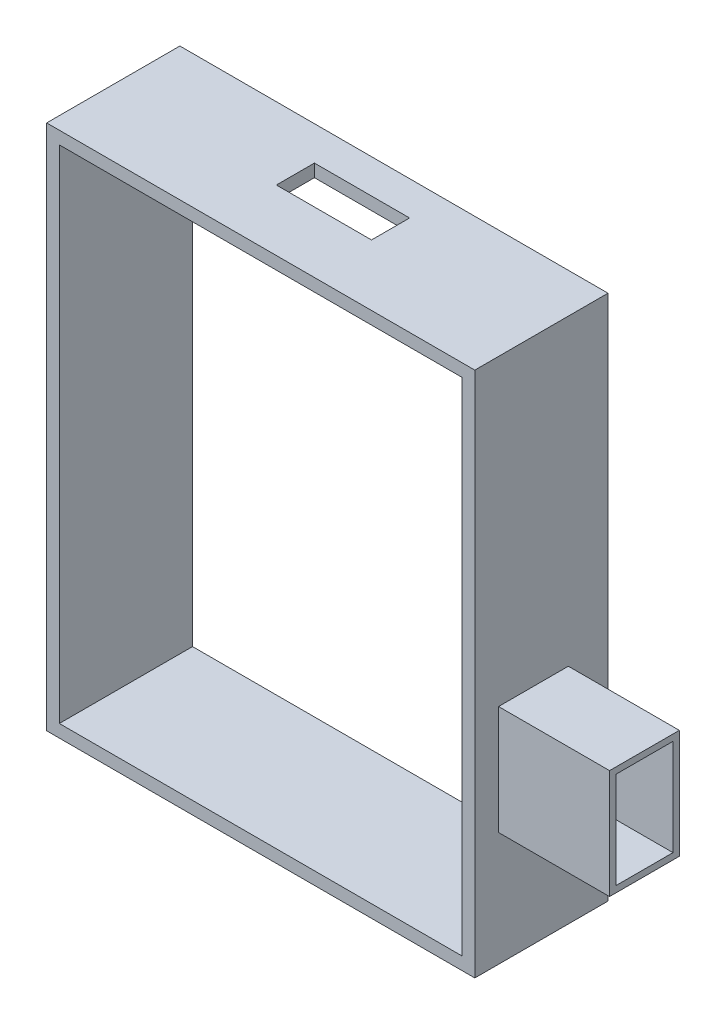
ISO-10303-21;
HEADER;
FILE_DESCRIPTION(('STEP AP214'),'2;1');
FILE_NAME('part.step','',(''),(''),'','','');
FILE_SCHEMA(('AUTOMOTIVE_DESIGN { 1 0 10303 214 1 1 1 1 }'));
ENDSEC;
DATA;
#1=APPLICATION_CONTEXT('core data for automotive mechanical design processes');
#2=APPLICATION_PROTOCOL_DEFINITION('international standard','automotive_design',2000,#1);
#3=PRODUCT_CONTEXT('',#1,'mechanical');
#4=PRODUCT('Part','Part','',(#3));
#5=PRODUCT_RELATED_PRODUCT_CATEGORY('part','',(#4));
#6=PRODUCT_DEFINITION_FORMATION('','',#4);
#7=PRODUCT_DEFINITION_CONTEXT('part definition',#1,'design');
#8=PRODUCT_DEFINITION('design','',#6,#7);
#9=PRODUCT_DEFINITION_SHAPE('','',#8);
#10=(LENGTH_UNIT() NAMED_UNIT(*) SI_UNIT(.MILLI.,.METRE.));
#11=(NAMED_UNIT(*) PLANE_ANGLE_UNIT() SI_UNIT($,.RADIAN.));
#12=(NAMED_UNIT(*) SI_UNIT($,.STERADIAN.) SOLID_ANGLE_UNIT());
#13=UNCERTAINTY_MEASURE_WITH_UNIT(LENGTH_MEASURE(1.E-05),#10,'distance_accuracy_value','');
#14=(GEOMETRIC_REPRESENTATION_CONTEXT(3) GLOBAL_UNCERTAINTY_ASSIGNED_CONTEXT((#13)) GLOBAL_UNIT_ASSIGNED_CONTEXT((#10,
#11,#12)) REPRESENTATION_CONTEXT('',''));
#15=CARTESIAN_POINT('',(0.,0.,0.));
#16=DIRECTION('',(0.,0.,1.));
#17=DIRECTION('',(1.,0.,0.));
#18=AXIS2_PLACEMENT_3D('',#15,#16,#17);
#19=CARTESIAN_POINT('',(33.75,41.5,21.));
#20=DIRECTION('',(-1.,0.,0.));
#21=DIRECTION('',(0.,-1.,0.));
#22=AXIS2_PLACEMENT_3D('',#19,#20,#21);
#23=PLANE('',#22);
#24=DIRECTION('',(0.,1.,0.));
#25=VECTOR('',#24,1.);
#26=CARTESIAN_POINT('',(33.75,41.5,0.));
#27=LINE('',#26,#25);
#28=CARTESIAN_POINT('',(33.75,-41.5,0.));
#29=VERTEX_POINT('',#28);
#30=CARTESIAN_POINT('',(33.75,41.5,0.));
#31=VERTEX_POINT('',#30);
#32=EDGE_CURVE('E340',#29,#31,#27,.T.);
#33=ORIENTED_EDGE('',*,*,#32,.T.);
#34=DIRECTION('',(0.,0.,-1.));
#35=VECTOR('',#34,1.);
#36=CARTESIAN_POINT('',(33.75,41.5,21.));
#37=LINE('',#36,#35);
#38=CARTESIAN_POINT('',(33.75,41.5,21.));
#39=VERTEX_POINT('',#38);
#40=EDGE_CURVE('E378',#39,#31,#37,.T.);
#41=ORIENTED_EDGE('',*,*,#40,.F.);
#42=DIRECTION('',(0.,1.,0.));
#43=VECTOR('',#42,1.);
#44=CARTESIAN_POINT('',(33.75,41.5,21.));
#45=LINE('',#44,#43);
#46=CARTESIAN_POINT('',(33.75,-41.5,21.));
#47=VERTEX_POINT('',#46);
#48=EDGE_CURVE('E341',#47,#39,#45,.T.);
#49=ORIENTED_EDGE('',*,*,#48,.F.);
#50=DIRECTION('',(0.,0.,-1.));
#51=VECTOR('',#50,1.);
#52=CARTESIAN_POINT('',(33.75,-41.5,21.));
#53=LINE('',#52,#51);
#54=EDGE_CURVE('E355',#47,#29,#53,.T.);
#55=ORIENTED_EDGE('',*,*,#54,.T.);
#56=EDGE_LOOP('',(#33,#41,#49,#55));
#57=FACE_BOUND('',#56,.T.);
#58=DIRECTION('',(0.,1.,0.));
#59=VECTOR('',#58,1.);
#60=CARTESIAN_POINT('',(33.75,-23.5071257530308,6.25455683701878));
#61=LINE('',#60,#59);
#62=CARTESIAN_POINT('',(33.75,-23.5071257530308,6.25455683701878));
#63=VERTEX_POINT('',#62);
#64=CARTESIAN_POINT('',(33.75,-6.30712575303083,6.25455683701878));
#65=VERTEX_POINT('',#64);
#66=EDGE_CURVE('E252',#63,#65,#61,.T.);
#67=ORIENTED_EDGE('',*,*,#66,.F.);
#68=DIRECTION('',(0.,0.,-1.));
#69=VECTOR('',#68,1.);
#70=CARTESIAN_POINT('',(33.75,-23.5071257530308,6.25455683701878));
#71=LINE('',#70,#69);
#72=CARTESIAN_POINT('',(33.75,-23.5071257530308,17.2545568370188));
#73=VERTEX_POINT('',#72);
#74=EDGE_CURVE('E258',#73,#63,#71,.T.);
#75=ORIENTED_EDGE('',*,*,#74,.F.);
#76=DIRECTION('',(0.,-1.,0.));
#77=VECTOR('',#76,1.);
#78=CARTESIAN_POINT('',(33.75,-23.5071257530308,17.2545568370188));
#79=LINE('',#78,#77);
#80=CARTESIAN_POINT('',(33.75,-6.30712575303084,17.2545568370188));
#81=VERTEX_POINT('',#80);
#82=EDGE_CURVE('E275',#81,#73,#79,.T.);
#83=ORIENTED_EDGE('',*,*,#82,.F.);
#84=DIRECTION('',(0.,0.,1.));
#85=VECTOR('',#84,1.);
#86=CARTESIAN_POINT('',(33.75,-6.30712575303083,6.25455683701878));
#87=LINE('',#86,#85);
#88=EDGE_CURVE('E271',#65,#81,#87,.T.);
#89=ORIENTED_EDGE('',*,*,#88,.F.);
#90=EDGE_LOOP('',(#67,#75,#83,#89));
#91=FACE_BOUND('',#90,.T.);
#92=ADVANCED_FACE('F47',(#57,#91),#23,.F.);
#93=CARTESIAN_POINT('',(0.,0.,21.));
#94=DIRECTION('',(0.,0.,-1.));
#95=DIRECTION('',(-1.,0.,0.));
#96=AXIS2_PLACEMENT_3D('',#93,#94,#95);
#97=PLANE('',#96);
#98=ORIENTED_EDGE('',*,*,#48,.T.);
#99=DIRECTION('',(-1.,0.,0.));
#100=VECTOR('',#99,1.);
#101=CARTESIAN_POINT('',(33.75,41.5,21.));
#102=LINE('',#101,#100);
#103=CARTESIAN_POINT('',(-33.75,41.5,21.));
#104=VERTEX_POINT('',#103);
#105=EDGE_CURVE('E345',#39,#104,#102,.T.);
#106=ORIENTED_EDGE('',*,*,#105,.T.);
#107=DIRECTION('',(0.,-1.,0.));
#108=VECTOR('',#107,1.);
#109=CARTESIAN_POINT('',(-33.75,41.5,21.));
#110=LINE('',#109,#108);
#111=CARTESIAN_POINT('',(-33.75,-41.5,21.));
#112=VERTEX_POINT('',#111);
#113=EDGE_CURVE('E349',#104,#112,#110,.T.);
#114=ORIENTED_EDGE('',*,*,#113,.T.);
#115=DIRECTION('',(1.,0.,0.));
#116=VECTOR('',#115,1.);
#117=CARTESIAN_POINT('',(33.75,-41.5,21.));
#118=LINE('',#117,#116);
#119=EDGE_CURVE('E352',#112,#47,#118,.T.);
#120=ORIENTED_EDGE('',*,*,#119,.T.);
#121=EDGE_LOOP('',(#98,#106,#114,#120));
#122=FACE_BOUND('',#121,.T.);
#123=DIRECTION('',(0.,-1.,0.));
#124=VECTOR('',#123,1.);
#125=CARTESIAN_POINT('',(-31.75,39.5,21.));
#126=LINE('',#125,#124);
#127=CARTESIAN_POINT('',(-31.75,39.5,21.));
#128=VERTEX_POINT('',#127);
#129=CARTESIAN_POINT('',(-31.75,-39.5,21.));
#130=VERTEX_POINT('',#129);
#131=EDGE_CURVE('E298',#128,#130,#126,.T.);
#132=ORIENTED_EDGE('',*,*,#131,.F.);
#133=DIRECTION('',(-1.,0.,0.));
#134=VECTOR('',#133,1.);
#135=CARTESIAN_POINT('',(31.75,39.5,21.));
#136=LINE('',#135,#134);
#137=CARTESIAN_POINT('',(31.75,39.5,21.));
#138=VERTEX_POINT('',#137);
#139=EDGE_CURVE('E309',#138,#128,#136,.T.);
#140=ORIENTED_EDGE('',*,*,#139,.F.);
#141=DIRECTION('',(0.,1.,0.));
#142=VECTOR('',#141,1.);
#143=CARTESIAN_POINT('',(31.75,39.5,21.));
#144=LINE('',#143,#142);
#145=CARTESIAN_POINT('',(31.75,-39.5,21.));
#146=VERTEX_POINT('',#145);
#147=EDGE_CURVE('E305',#146,#138,#144,.T.);
#148=ORIENTED_EDGE('',*,*,#147,.F.);
#149=DIRECTION('',(1.,0.,0.));
#150=VECTOR('',#149,1.);
#151=CARTESIAN_POINT('',(31.75,-39.5,21.));
#152=LINE('',#151,#150);
#153=EDGE_CURVE('E301',#130,#146,#152,.T.);
#154=ORIENTED_EDGE('',*,*,#153,.F.);
#155=EDGE_LOOP('',(#132,#140,#148,#154));
#156=FACE_BOUND('',#155,.T.);
#157=ADVANCED_FACE('F436',(#122,#156),#97,.F.);
#158=CARTESIAN_POINT('',(0.,0.,0.));
#159=DIRECTION('',(0.,0.,-1.));
#160=DIRECTION('',(-1.,0.,0.));
#161=AXIS2_PLACEMENT_3D('',#158,#159,#160);
#162=PLANE('',#161);
#163=ORIENTED_EDGE('',*,*,#32,.F.);
#164=DIRECTION('',(1.,0.,0.));
#165=VECTOR('',#164,1.);
#166=CARTESIAN_POINT('',(33.75,-41.5,0.));
#167=LINE('',#166,#165);
#168=CARTESIAN_POINT('',(-33.75,-41.5,0.));
#169=VERTEX_POINT('',#168);
#170=EDGE_CURVE('E346',#169,#29,#167,.T.);
#171=ORIENTED_EDGE('',*,*,#170,.F.);
#172=DIRECTION('',(0.,-1.,0.));
#173=VECTOR('',#172,1.);
#174=CARTESIAN_POINT('',(-33.75,41.5,0.));
#175=LINE('',#174,#173);
#176=CARTESIAN_POINT('',(-33.75,41.5,0.));
#177=VERTEX_POINT('',#176);
#178=EDGE_CURVE('E362',#177,#169,#175,.T.);
#179=ORIENTED_EDGE('',*,*,#178,.F.);
#180=DIRECTION('',(-1.,0.,0.));
#181=VECTOR('',#180,1.);
#182=CARTESIAN_POINT('',(33.75,41.5,0.));
#183=LINE('',#182,#181);
#184=EDGE_CURVE('E359',#31,#177,#183,.T.);
#185=ORIENTED_EDGE('',*,*,#184,.F.);
#186=EDGE_LOOP('',(#163,#171,#179,#185));
#187=FACE_BOUND('',#186,.T.);
#188=DIRECTION('',(-1.,0.,0.));
#189=VECTOR('',#188,1.);
#190=CARTESIAN_POINT('',(31.75,39.5,0.));
#191=LINE('',#190,#189);
#192=CARTESIAN_POINT('',(31.75,39.5,0.));
#193=VERTEX_POINT('',#192);
#194=CARTESIAN_POINT('',(-31.75,39.5,0.));
#195=VERTEX_POINT('',#194);
#196=EDGE_CURVE('E302',#193,#195,#191,.T.);
#197=ORIENTED_EDGE('',*,*,#196,.T.);
#198=DIRECTION('',(0.,-1.,0.));
#199=VECTOR('',#198,1.);
#200=CARTESIAN_POINT('',(-31.75,39.5,0.));
#201=LINE('',#200,#199);
#202=CARTESIAN_POINT('',(-31.75,-39.5,0.));
#203=VERTEX_POINT('',#202);
#204=EDGE_CURVE('E297',#195,#203,#201,.T.);
#205=ORIENTED_EDGE('',*,*,#204,.T.);
#206=DIRECTION('',(1.,0.,0.));
#207=VECTOR('',#206,1.);
#208=CARTESIAN_POINT('',(31.75,-39.5,0.));
#209=LINE('',#208,#207);
#210=CARTESIAN_POINT('',(31.75,-39.5,0.));
#211=VERTEX_POINT('',#210);
#212=EDGE_CURVE('E316',#203,#211,#209,.T.);
#213=ORIENTED_EDGE('',*,*,#212,.T.);
#214=DIRECTION('',(0.,1.,0.));
#215=VECTOR('',#214,1.);
#216=CARTESIAN_POINT('',(31.75,39.5,0.));
#217=LINE('',#216,#215);
#218=EDGE_CURVE('E320',#211,#193,#217,.T.);
#219=ORIENTED_EDGE('',*,*,#218,.T.);
#220=EDGE_LOOP('',(#197,#205,#213,#219));
#221=FACE_BOUND('',#220,.T.);
#222=ADVANCED_FACE('F443',(#187,#221),#162,.T.);
#223=CARTESIAN_POINT('',(33.75,41.5,21.));
#224=DIRECTION('',(0.,-1.,0.));
#225=DIRECTION('',(1.,0.,0.));
#226=AXIS2_PLACEMENT_3D('',#223,#224,#225);
#227=PLANE('',#226);
#228=DIRECTION('',(1.,0.,0.));
#229=VECTOR('',#228,1.);
#230=CARTESIAN_POINT('',(7.83952370392265,41.5,11.3731016970316));
#231=LINE('',#230,#229);
#232=CARTESIAN_POINT('',(-7.16047629607734,41.5,11.3731016970316));
#233=VERTEX_POINT('',#232);
#234=CARTESIAN_POINT('',(7.83952370392265,41.5,11.3731016970316));
#235=VERTEX_POINT('',#234);
#236=EDGE_CURVE('E203',#233,#235,#231,.T.);
#237=ORIENTED_EDGE('',*,*,#236,.F.);
#238=DIRECTION('',(0.,0.,1.));
#239=VECTOR('',#238,1.);
#240=CARTESIAN_POINT('',(-7.16047629607735,41.5,5.37310169703157));
#241=LINE('',#240,#239);
#242=CARTESIAN_POINT('',(-7.16047629607735,41.5,5.37310169703157));
#243=VERTEX_POINT('',#242);
#244=EDGE_CURVE('E63',#243,#233,#241,.T.);
#245=ORIENTED_EDGE('',*,*,#244,.F.);
#246=DIRECTION('',(-1.,0.,0.));
#247=VECTOR('',#246,1.);
#248=CARTESIAN_POINT('',(7.83952370392265,41.5,5.37310169703157));
#249=LINE('',#248,#247);
#250=CARTESIAN_POINT('',(7.83952370392265,41.5,5.37310169703157));
#251=VERTEX_POINT('',#250);
#252=EDGE_CURVE('E211',#251,#243,#249,.T.);
#253=ORIENTED_EDGE('',*,*,#252,.F.);
#254=DIRECTION('',(0.,0.,-1.));
#255=VECTOR('',#254,1.);
#256=CARTESIAN_POINT('',(7.83952370392265,41.5,5.37310169703157));
#257=LINE('',#256,#255);
#258=EDGE_CURVE('E193',#235,#251,#257,.T.);
#259=ORIENTED_EDGE('',*,*,#258,.F.);
#260=EDGE_LOOP('',(#237,#245,#253,#259));
#261=FACE_BOUND('',#260,.T.);
#262=ORIENTED_EDGE('',*,*,#184,.T.);
#263=DIRECTION('',(0.,0.,-1.));
#264=VECTOR('',#263,1.);
#265=CARTESIAN_POINT('',(-33.75,41.5,21.));
#266=LINE('',#265,#264);
#267=EDGE_CURVE('E374',#104,#177,#266,.T.);
#268=ORIENTED_EDGE('',*,*,#267,.F.);
#269=ORIENTED_EDGE('',*,*,#105,.F.);
#270=ORIENTED_EDGE('',*,*,#40,.T.);
#271=EDGE_LOOP('',(#262,#268,#269,#270));
#272=FACE_BOUND('',#271,.T.);
#273=ADVANCED_FACE('F208',(#261,#272),#227,.F.);
#274=CARTESIAN_POINT('',(-33.75,41.5,21.));
#275=DIRECTION('',(1.,0.,0.));
#276=DIRECTION('',(0.,1.,0.));
#277=AXIS2_PLACEMENT_3D('',#274,#275,#276);
#278=PLANE('',#277);
#279=ORIENTED_EDGE('',*,*,#178,.T.);
#280=DIRECTION('',(0.,0.,-1.));
#281=VECTOR('',#280,1.);
#282=CARTESIAN_POINT('',(-33.75,-41.5,21.));
#283=LINE('',#282,#281);
#284=EDGE_CURVE('E370',#112,#169,#283,.T.);
#285=ORIENTED_EDGE('',*,*,#284,.F.);
#286=ORIENTED_EDGE('',*,*,#113,.F.);
#287=ORIENTED_EDGE('',*,*,#267,.T.);
#288=EDGE_LOOP('',(#279,#285,#286,#287));
#289=FACE_BOUND('',#288,.T.);
#290=ADVANCED_FACE('F450',(#289),#278,.F.);
#291=CARTESIAN_POINT('',(33.75,-41.5,21.));
#292=DIRECTION('',(0.,1.,0.));
#293=DIRECTION('',(-1.,0.,0.));
#294=AXIS2_PLACEMENT_3D('',#291,#292,#293);
#295=PLANE('',#294);
#296=ORIENTED_EDGE('',*,*,#170,.T.);
#297=ORIENTED_EDGE('',*,*,#54,.F.);
#298=ORIENTED_EDGE('',*,*,#119,.F.);
#299=ORIENTED_EDGE('',*,*,#284,.T.);
#300=EDGE_LOOP('',(#296,#297,#298,#299));
#301=FACE_BOUND('',#300,.T.);
#302=ADVANCED_FACE('F453',(#301),#295,.F.);
#303=CARTESIAN_POINT('',(-31.75,39.5,21.));
#304=DIRECTION('',(1.,0.,0.));
#305=DIRECTION('',(0.,0.,-1.));
#306=AXIS2_PLACEMENT_3D('',#303,#304,#305);
#307=PLANE('',#306);
#308=ORIENTED_EDGE('',*,*,#204,.F.);
#309=DIRECTION('',(0.,0.,-1.));
#310=VECTOR('',#309,1.);
#311=CARTESIAN_POINT('',(-31.75,39.5,21.));
#312=LINE('',#311,#310);
#313=EDGE_CURVE('E312',#128,#195,#312,.T.);
#314=ORIENTED_EDGE('',*,*,#313,.F.);
#315=ORIENTED_EDGE('',*,*,#131,.T.);
#316=DIRECTION('',(0.,0.,-1.));
#317=VECTOR('',#316,1.);
#318=CARTESIAN_POINT('',(-31.75,-39.5,21.));
#319=LINE('',#318,#317);
#320=EDGE_CURVE('E336',#130,#203,#319,.T.);
#321=ORIENTED_EDGE('',*,*,#320,.T.);
#322=EDGE_LOOP('',(#308,#314,#315,#321));
#323=FACE_BOUND('',#322,.T.);
#324=ADVANCED_FACE('F457',(#323),#307,.T.);
#325=CARTESIAN_POINT('',(31.75,-39.5,21.));
#326=DIRECTION('',(0.,1.,0.));
#327=DIRECTION('',(-1.,0.,0.));
#328=AXIS2_PLACEMENT_3D('',#325,#326,#327);
#329=PLANE('',#328);
#330=ORIENTED_EDGE('',*,*,#212,.F.);
#331=ORIENTED_EDGE('',*,*,#320,.F.);
#332=ORIENTED_EDGE('',*,*,#153,.T.);
#333=DIRECTION('',(0.,0.,-1.));
#334=VECTOR('',#333,1.);
#335=CARTESIAN_POINT('',(31.75,-39.5,21.));
#336=LINE('',#335,#334);
#337=EDGE_CURVE('E333',#146,#211,#336,.T.);
#338=ORIENTED_EDGE('',*,*,#337,.T.);
#339=EDGE_LOOP('',(#330,#331,#332,#338));
#340=FACE_BOUND('',#339,.T.);
#341=ADVANCED_FACE('F464',(#340),#329,.T.);
#342=CARTESIAN_POINT('',(31.75,39.5,21.));
#343=DIRECTION('',(-1.,0.,0.));
#344=DIRECTION('',(0.,-1.,0.));
#345=AXIS2_PLACEMENT_3D('',#342,#343,#344);
#346=PLANE('',#345);
#347=DIRECTION('',(0.,-1.,0.));
#348=VECTOR('',#347,1.);
#349=CARTESIAN_POINT('',(31.75,39.5,7.25455683701878));
#350=LINE('',#349,#348);
#351=CARTESIAN_POINT('',(31.75,-6.30712575303083,7.25455683701878));
#352=VERTEX_POINT('',#351);
#353=CARTESIAN_POINT('',(31.75,-22.5071257530308,7.25455683701878));
#354=VERTEX_POINT('',#353);
#355=EDGE_CURVE('E389',#352,#354,#350,.T.);
#356=ORIENTED_EDGE('',*,*,#355,.F.);
#357=DIRECTION('',(0.,0.,-1.));
#358=VECTOR('',#357,1.);
#359=CARTESIAN_POINT('',(31.75,-6.30712575303084,21.));
#360=LINE('',#359,#358);
#361=CARTESIAN_POINT('',(31.75,-6.30712575303084,16.2545568370188));
#362=VERTEX_POINT('',#361);
#363=EDGE_CURVE('E397',#352,#362,#360,.F.);
#364=ORIENTED_EDGE('',*,*,#363,.T.);
#365=DIRECTION('',(0.,1.,0.));
#366=VECTOR('',#365,1.);
#367=CARTESIAN_POINT('',(31.75,39.5,16.2545568370188));
#368=LINE('',#367,#366);
#369=CARTESIAN_POINT('',(31.75,-22.5071257530308,16.2545568370188));
#370=VERTEX_POINT('',#369);
#371=EDGE_CURVE('E382',#370,#362,#368,.T.);
#372=ORIENTED_EDGE('',*,*,#371,.F.);
#373=DIRECTION('',(0.,0.,1.));
#374=VECTOR('',#373,1.);
#375=CARTESIAN_POINT('',(31.75,-22.5071257530308,21.));
#376=LINE('',#375,#374);
#377=EDGE_CURVE('E385',#354,#370,#376,.T.);
#378=ORIENTED_EDGE('',*,*,#377,.F.);
#379=EDGE_LOOP('',(#356,#364,#372,#378));
#380=FACE_BOUND('',#379,.T.);
#381=ORIENTED_EDGE('',*,*,#218,.F.);
#382=ORIENTED_EDGE('',*,*,#337,.F.);
#383=ORIENTED_EDGE('',*,*,#147,.T.);
#384=DIRECTION('',(0.,0.,-1.));
#385=VECTOR('',#384,1.);
#386=CARTESIAN_POINT('',(31.75,39.5,21.));
#387=LINE('',#386,#385);
#388=EDGE_CURVE('E330',#138,#193,#387,.T.);
#389=ORIENTED_EDGE('',*,*,#388,.T.);
#390=EDGE_LOOP('',(#381,#382,#383,#389));
#391=FACE_BOUND('',#390,.T.);
#392=ADVANCED_FACE('F467',(#380,#391),#346,.T.);
#393=CARTESIAN_POINT('',(31.75,39.5,21.));
#394=DIRECTION('',(0.,-1.,0.));
#395=DIRECTION('',(0.,0.,-1.));
#396=AXIS2_PLACEMENT_3D('',#393,#394,#395);
#397=PLANE('',#396);
#398=DIRECTION('',(0.,0.,-1.));
#399=VECTOR('',#398,1.);
#400=CARTESIAN_POINT('',(-7.16047629607734,39.5,21.));
#401=LINE('',#400,#399);
#402=CARTESIAN_POINT('',(-7.16047629607734,39.5,11.3731016970316));
#403=VERTEX_POINT('',#402);
#404=CARTESIAN_POINT('',(-7.16047629607735,39.5,5.37310169703157));
#405=VERTEX_POINT('',#404);
#406=EDGE_CURVE('E11',#403,#405,#401,.T.);
#407=ORIENTED_EDGE('',*,*,#406,.F.);
#408=DIRECTION('',(-1.,0.,0.));
#409=VECTOR('',#408,1.);
#410=CARTESIAN_POINT('',(31.75,39.5,11.3731016970316));
#411=LINE('',#410,#409);
#412=CARTESIAN_POINT('',(7.83952370392265,39.5,11.3731016970316));
#413=VERTEX_POINT('',#412);
#414=EDGE_CURVE('E408',#413,#403,#411,.T.);
#415=ORIENTED_EDGE('',*,*,#414,.F.);
#416=DIRECTION('',(0.,0.,1.));
#417=VECTOR('',#416,1.);
#418=CARTESIAN_POINT('',(7.83952370392266,39.5,21.));
#419=LINE('',#418,#417);
#420=CARTESIAN_POINT('',(7.83952370392265,39.5,5.37310169703157));
#421=VERTEX_POINT('',#420);
#422=EDGE_CURVE('E196',#421,#413,#419,.T.);
#423=ORIENTED_EDGE('',*,*,#422,.F.);
#424=DIRECTION('',(1.,0.,0.));
#425=VECTOR('',#424,1.);
#426=CARTESIAN_POINT('',(31.75,39.5,5.37310169703156));
#427=LINE('',#426,#425);
#428=EDGE_CURVE('E56',#405,#421,#427,.T.);
#429=ORIENTED_EDGE('',*,*,#428,.F.);
#430=EDGE_LOOP('',(#407,#415,#423,#429));
#431=FACE_BOUND('',#430,.T.);
#432=ORIENTED_EDGE('',*,*,#196,.F.);
#433=ORIENTED_EDGE('',*,*,#388,.F.);
#434=ORIENTED_EDGE('',*,*,#139,.T.);
#435=ORIENTED_EDGE('',*,*,#313,.T.);
#436=EDGE_LOOP('',(#432,#433,#434,#435));
#437=FACE_BOUND('',#436,.T.);
#438=ADVANCED_FACE('F419',(#431,#437),#397,.T.);
#439=CARTESIAN_POINT('',(51.25,0.,0.));
#440=DIRECTION('',(1.,0.,0.));
#441=DIRECTION('',(0.,0.,-1.));
#442=AXIS2_PLACEMENT_3D('',#439,#440,#441);
#443=PLANE('',#442);
#444=DIRECTION('',(0.,1.,0.));
#445=VECTOR('',#444,1.);
#446=CARTESIAN_POINT('',(51.25,-23.5071257530308,6.25455683701878));
#447=LINE('',#446,#445);
#448=CARTESIAN_POINT('',(51.25,-23.5071257530308,6.25455683701878));
#449=VERTEX_POINT('',#448);
#450=CARTESIAN_POINT('',(51.25,-6.30712575303083,6.25455683701878));
#451=VERTEX_POINT('',#450);
#452=EDGE_CURVE('E253',#449,#451,#447,.T.);
#453=ORIENTED_EDGE('',*,*,#452,.T.);
#454=DIRECTION('',(0.,0.,1.));
#455=VECTOR('',#454,1.);
#456=CARTESIAN_POINT('',(51.25,-6.30712575303083,6.25455683701878));
#457=LINE('',#456,#455);
#458=CARTESIAN_POINT('',(51.25,-6.30712575303083,17.2545568370188));
#459=VERTEX_POINT('',#458);
#460=EDGE_CURVE('E257',#451,#459,#457,.T.);
#461=ORIENTED_EDGE('',*,*,#460,.T.);
#462=DIRECTION('',(0.,-1.,0.));
#463=VECTOR('',#462,1.);
#464=CARTESIAN_POINT('',(51.25,-23.5071257530308,17.2545568370188));
#465=LINE('',#464,#463);
#466=CARTESIAN_POINT('',(51.25,-23.5071257530308,17.2545568370188));
#467=VERTEX_POINT('',#466);
#468=EDGE_CURVE('E261',#459,#467,#465,.T.);
#469=ORIENTED_EDGE('',*,*,#468,.T.);
#470=DIRECTION('',(0.,0.,-1.));
#471=VECTOR('',#470,1.);
#472=CARTESIAN_POINT('',(51.25,-23.5071257530308,6.25455683701878));
#473=LINE('',#472,#471);
#474=EDGE_CURVE('E264',#467,#449,#473,.T.);
#475=ORIENTED_EDGE('',*,*,#474,.T.);
#476=EDGE_LOOP('',(#453,#461,#469,#475));
#477=FACE_BOUND('',#476,.T.);
#478=DIRECTION('',(0.,0.,-1.));
#479=VECTOR('',#478,1.);
#480=CARTESIAN_POINT('',(51.25,-22.5071257530308,7.25455683701878));
#481=LINE('',#480,#479);
#482=CARTESIAN_POINT('',(51.25,-22.5071257530308,16.2545568370188));
#483=VERTEX_POINT('',#482);
#484=CARTESIAN_POINT('',(51.25,-22.5071257530308,7.25455683701878));
#485=VERTEX_POINT('',#484);
#486=EDGE_CURVE('E228',#483,#485,#481,.T.);
#487=ORIENTED_EDGE('',*,*,#486,.F.);
#488=DIRECTION('',(0.,-1.,0.));
#489=VECTOR('',#488,1.);
#490=CARTESIAN_POINT('',(51.25,-22.5071257530308,16.2545568370188));
#491=LINE('',#490,#489);
#492=CARTESIAN_POINT('',(51.25,-7.30712575303083,16.2545568370188));
#493=VERTEX_POINT('',#492);
#494=EDGE_CURVE('E221',#493,#483,#491,.T.);
#495=ORIENTED_EDGE('',*,*,#494,.F.);
#496=DIRECTION('',(0.,0.,1.));
#497=VECTOR('',#496,1.);
#498=CARTESIAN_POINT('',(51.25,-7.30712575303083,7.25455683701878));
#499=LINE('',#498,#497);
#500=CARTESIAN_POINT('',(51.25,-7.30712575303083,7.25455683701878));
#501=VERTEX_POINT('',#500);
#502=EDGE_CURVE('E235',#501,#493,#499,.T.);
#503=ORIENTED_EDGE('',*,*,#502,.F.);
#504=DIRECTION('',(0.,1.,0.));
#505=VECTOR('',#504,1.);
#506=CARTESIAN_POINT('',(51.25,-22.5071257530308,7.25455683701878));
#507=LINE('',#506,#505);
#508=EDGE_CURVE('E231',#485,#501,#507,.T.);
#509=ORIENTED_EDGE('',*,*,#508,.F.);
#510=EDGE_LOOP('',(#487,#495,#503,#509));
#511=FACE_BOUND('',#510,.T.);
#512=ADVANCED_FACE('F473',(#477,#511),#443,.T.);
#513=CARTESIAN_POINT('',(51.25,-23.5071257530308,6.25455683701878));
#514=DIRECTION('',(0.,0.,1.));
#515=DIRECTION('',(1.,0.,0.));
#516=AXIS2_PLACEMENT_3D('',#513,#514,#515);
#517=PLANE('',#516);
#518=ORIENTED_EDGE('',*,*,#66,.T.);
#519=DIRECTION('',(-1.,0.,0.));
#520=VECTOR('',#519,1.);
#521=CARTESIAN_POINT('',(51.25,-6.30712575303083,6.25455683701878));
#522=LINE('',#521,#520);
#523=EDGE_CURVE('E293',#451,#65,#522,.T.);
#524=ORIENTED_EDGE('',*,*,#523,.F.);
#525=ORIENTED_EDGE('',*,*,#452,.F.);
#526=DIRECTION('',(-1.,0.,0.));
#527=VECTOR('',#526,1.);
#528=CARTESIAN_POINT('',(51.25,-23.5071257530308,6.25455683701878));
#529=LINE('',#528,#527);
#530=EDGE_CURVE('E267',#449,#63,#529,.T.);
#531=ORIENTED_EDGE('',*,*,#530,.T.);
#532=EDGE_LOOP('',(#518,#524,#525,#531));
#533=FACE_BOUND('',#532,.T.);
#534=ADVANCED_FACE('F474',(#533),#517,.F.);
#535=CARTESIAN_POINT('',(51.25,-6.30712575303083,6.25455683701878));
#536=DIRECTION('',(0.,-1.,0.));
#537=DIRECTION('',(1.,0.,0.));
#538=AXIS2_PLACEMENT_3D('',#535,#536,#537);
#539=PLANE('',#538);
#540=ORIENTED_EDGE('',*,*,#88,.T.);
#541=DIRECTION('',(-1.,0.,0.));
#542=VECTOR('',#541,1.);
#543=CARTESIAN_POINT('',(51.25,-6.30712575303083,17.2545568370188));
#544=LINE('',#543,#542);
#545=EDGE_CURVE('E289',#459,#81,#544,.T.);
#546=ORIENTED_EDGE('',*,*,#545,.F.);
#547=ORIENTED_EDGE('',*,*,#460,.F.);
#548=ORIENTED_EDGE('',*,*,#523,.T.);
#549=EDGE_LOOP('',(#540,#546,#547,#548));
#550=FACE_BOUND('',#549,.T.);
#551=ADVANCED_FACE('F477',(#550),#539,.F.);
#552=CARTESIAN_POINT('',(51.25,-23.5071257530308,17.2545568370188));
#553=DIRECTION('',(0.,0.,-1.));
#554=DIRECTION('',(-1.,0.,0.));
#555=AXIS2_PLACEMENT_3D('',#552,#553,#554);
#556=PLANE('',#555);
#557=ORIENTED_EDGE('',*,*,#82,.T.);
#558=DIRECTION('',(-1.,0.,0.));
#559=VECTOR('',#558,1.);
#560=CARTESIAN_POINT('',(51.25,-23.5071257530308,17.2545568370188));
#561=LINE('',#560,#559);
#562=EDGE_CURVE('E285',#467,#73,#561,.T.);
#563=ORIENTED_EDGE('',*,*,#562,.F.);
#564=ORIENTED_EDGE('',*,*,#468,.F.);
#565=ORIENTED_EDGE('',*,*,#545,.T.);
#566=EDGE_LOOP('',(#557,#563,#564,#565));
#567=FACE_BOUND('',#566,.T.);
#568=ADVANCED_FACE('F481',(#567),#556,.F.);
#569=CARTESIAN_POINT('',(51.25,-23.5071257530308,6.25455683701878));
#570=DIRECTION('',(0.,1.,0.));
#571=DIRECTION('',(-1.,0.,0.));
#572=AXIS2_PLACEMENT_3D('',#569,#570,#571);
#573=PLANE('',#572);
#574=ORIENTED_EDGE('',*,*,#74,.T.);
#575=ORIENTED_EDGE('',*,*,#530,.F.);
#576=ORIENTED_EDGE('',*,*,#474,.F.);
#577=ORIENTED_EDGE('',*,*,#562,.T.);
#578=EDGE_LOOP('',(#574,#575,#576,#577));
#579=FACE_BOUND('',#578,.T.);
#580=ADVANCED_FACE('F485',(#579),#573,.F.);
#581=CARTESIAN_POINT('',(51.25,-22.5071257530308,16.2545568370188));
#582=DIRECTION('',(0.,0.,-1.));
#583=DIRECTION('',(-1.,0.,0.));
#584=AXIS2_PLACEMENT_3D('',#581,#582,#583);
#585=PLANE('',#584);
#586=DIRECTION('',(-1.,0.,0.));
#587=VECTOR('',#586,1.);
#588=CARTESIAN_POINT('',(51.25,-22.5071257530308,16.2545568370188));
#589=LINE('',#588,#587);
#590=EDGE_CURVE('E249',#483,#370,#589,.T.);
#591=ORIENTED_EDGE('',*,*,#590,.T.);
#592=ORIENTED_EDGE('',*,*,#371,.T.);
#593=CARTESIAN_POINT('',(32.75,-6.30712575303083,16.2545568370188));
#594=DIRECTION('',(0.,0.,-1.));
#595=DIRECTION('',(-1.,0.,0.));
#596=AXIS2_PLACEMENT_3D('',#593,#594,#595);
#597=CIRCLE('',#596,1.);
#598=CARTESIAN_POINT('',(32.75,-7.30712575303083,16.2545568370188));
#599=VERTEX_POINT('',#598);
#600=EDGE_CURVE('E405',#362,#599,#597,.F.);
#601=ORIENTED_EDGE('',*,*,#600,.T.);
#602=DIRECTION('',(-1.,0.,0.));
#603=VECTOR('',#602,1.);
#604=CARTESIAN_POINT('',(51.25,-7.30712575303083,16.2545568370188));
#605=LINE('',#604,#603);
#606=EDGE_CURVE('E238',#493,#599,#605,.T.);
#607=ORIENTED_EDGE('',*,*,#606,.F.);
#608=ORIENTED_EDGE('',*,*,#494,.T.);
#609=EDGE_LOOP('',(#591,#592,#601,#607,#608));
#610=FACE_BOUND('',#609,.T.);
#611=ADVANCED_FACE('F489',(#610),#585,.T.);
#612=CARTESIAN_POINT('',(51.25,-22.5071257530308,7.25455683701878));
#613=DIRECTION('',(0.,1.,0.));
#614=DIRECTION('',(-1.,0.,0.));
#615=AXIS2_PLACEMENT_3D('',#612,#613,#614);
#616=PLANE('',#615);
#617=DIRECTION('',(-1.,0.,0.));
#618=VECTOR('',#617,1.);
#619=CARTESIAN_POINT('',(51.25,-22.5071257530308,7.25455683701878));
#620=LINE('',#619,#618);
#621=EDGE_CURVE('E246',#485,#354,#620,.T.);
#622=ORIENTED_EDGE('',*,*,#621,.T.);
#623=ORIENTED_EDGE('',*,*,#377,.T.);
#624=ORIENTED_EDGE('',*,*,#590,.F.);
#625=ORIENTED_EDGE('',*,*,#486,.T.);
#626=EDGE_LOOP('',(#622,#623,#624,#625));
#627=FACE_BOUND('',#626,.T.);
#628=ADVANCED_FACE('F495',(#627),#616,.T.);
#629=CARTESIAN_POINT('',(51.25,-22.5071257530308,7.25455683701878));
#630=DIRECTION('',(0.,0.,1.));
#631=DIRECTION('',(1.,0.,0.));
#632=AXIS2_PLACEMENT_3D('',#629,#630,#631);
#633=PLANE('',#632);
#634=DIRECTION('',(-1.,0.,0.));
#635=VECTOR('',#634,1.);
#636=CARTESIAN_POINT('',(51.25,-7.30712575303083,7.25455683701878));
#637=LINE('',#636,#635);
#638=CARTESIAN_POINT('',(32.75,-7.30712575303083,7.25455683701878));
#639=VERTEX_POINT('',#638);
#640=EDGE_CURVE('E242',#501,#639,#637,.T.);
#641=ORIENTED_EDGE('',*,*,#640,.T.);
#642=CARTESIAN_POINT('',(32.75,-6.30712575303083,7.25455683701878));
#643=DIRECTION('',(0.,0.,1.));
#644=DIRECTION('',(1.,0.,0.));
#645=AXIS2_PLACEMENT_3D('',#642,#643,#644);
#646=CIRCLE('',#645,1.);
#647=EDGE_CURVE('E401',#639,#352,#646,.F.);
#648=ORIENTED_EDGE('',*,*,#647,.T.);
#649=ORIENTED_EDGE('',*,*,#355,.T.);
#650=ORIENTED_EDGE('',*,*,#621,.F.);
#651=ORIENTED_EDGE('',*,*,#508,.T.);
#652=EDGE_LOOP('',(#641,#648,#649,#650,#651));
#653=FACE_BOUND('',#652,.T.);
#654=ADVANCED_FACE('F499',(#653),#633,.T.);
#655=CARTESIAN_POINT('',(51.25,-7.30712575303083,7.25455683701878));
#656=DIRECTION('',(0.,-1.,0.));
#657=DIRECTION('',(0.,0.,-1.));
#658=AXIS2_PLACEMENT_3D('',#655,#656,#657);
#659=PLANE('',#658);
#660=ORIENTED_EDGE('',*,*,#606,.T.);
#661=DIRECTION('',(0.,0.,-1.));
#662=VECTOR('',#661,1.);
#663=CARTESIAN_POINT('',(32.75,-7.30712575303083,7.25455683701878));
#664=LINE('',#663,#662);
#665=EDGE_CURVE('E393',#599,#639,#664,.T.);
#666=ORIENTED_EDGE('',*,*,#665,.T.);
#667=ORIENTED_EDGE('',*,*,#640,.F.);
#668=ORIENTED_EDGE('',*,*,#502,.T.);
#669=EDGE_LOOP('',(#660,#666,#667,#668));
#670=FACE_BOUND('',#669,.T.);
#671=ADVANCED_FACE('F431',(#670),#659,.T.);
#672=CARTESIAN_POINT('',(32.75,-6.30712575303083,7.25455683701878));
#673=DIRECTION('',(0.,0.,-1.));
#674=DIRECTION('',(0.,1.,0.));
#675=AXIS2_PLACEMENT_3D('',#672,#673,#674);
#676=CYLINDRICAL_SURFACE('',#675,1.);
#677=ORIENTED_EDGE('',*,*,#600,.F.);
#678=ORIENTED_EDGE('',*,*,#363,.F.);
#679=ORIENTED_EDGE('',*,*,#647,.F.);
#680=ORIENTED_EDGE('',*,*,#665,.F.);
#681=EDGE_LOOP('',(#677,#678,#679,#680));
#682=FACE_BOUND('',#681,.T.);
#683=ADVANCED_FACE('F49',(#682),#676,.T.);
#684=CARTESIAN_POINT('',(-7.16047629607735,29.5,5.37310169703157));
#685=DIRECTION('',(-1.,0.,0.));
#686=DIRECTION('',(0.,0.,1.));
#687=AXIS2_PLACEMENT_3D('',#684,#685,#686);
#688=PLANE('',#687);
#689=ORIENTED_EDGE('',*,*,#406,.T.);
#690=DIRECTION('',(0.,1.,0.));
#691=VECTOR('',#690,1.);
#692=CARTESIAN_POINT('',(-7.16047629607735,29.5,5.37310169703157));
#693=LINE('',#692,#691);
#694=EDGE_CURVE('E218',#405,#243,#693,.T.);
#695=ORIENTED_EDGE('',*,*,#694,.T.);
#696=ORIENTED_EDGE('',*,*,#244,.T.);
#697=DIRECTION('',(0.,1.,0.));
#698=VECTOR('',#697,1.);
#699=CARTESIAN_POINT('',(-7.16047629607734,29.5,11.3731016970316));
#700=LINE('',#699,#698);
#701=EDGE_CURVE('E200',#403,#233,#700,.T.);
#702=ORIENTED_EDGE('',*,*,#701,.F.);
#703=EDGE_LOOP('',(#689,#695,#696,#702));
#704=FACE_BOUND('',#703,.T.);
#705=ADVANCED_FACE('F421',(#704),#688,.F.);
#706=CARTESIAN_POINT('',(7.83952370392266,29.5,5.37310169703157));
#707=DIRECTION('',(0.,0.,-1.));
#708=DIRECTION('',(-1.,0.,0.));
#709=AXIS2_PLACEMENT_3D('',#706,#707,#708);
#710=PLANE('',#709);
#711=ORIENTED_EDGE('',*,*,#428,.T.);
#712=DIRECTION('',(0.,1.,0.));
#713=VECTOR('',#712,1.);
#714=CARTESIAN_POINT('',(7.83952370392266,29.5,5.37310169703157));
#715=LINE('',#714,#713);
#716=EDGE_CURVE('E199',#421,#251,#715,.T.);
#717=ORIENTED_EDGE('',*,*,#716,.T.);
#718=ORIENTED_EDGE('',*,*,#252,.T.);
#719=ORIENTED_EDGE('',*,*,#694,.F.);
#720=EDGE_LOOP('',(#711,#717,#718,#719));
#721=FACE_BOUND('',#720,.T.);
#722=ADVANCED_FACE('F416',(#721),#710,.F.);
#723=CARTESIAN_POINT('',(7.83952370392266,29.5,5.37310169703157));
#724=DIRECTION('',(1.,0.,0.));
#725=DIRECTION('',(0.,1.,0.));
#726=AXIS2_PLACEMENT_3D('',#723,#724,#725);
#727=PLANE('',#726);
#728=ORIENTED_EDGE('',*,*,#422,.T.);
#729=DIRECTION('',(0.,1.,0.));
#730=VECTOR('',#729,1.);
#731=CARTESIAN_POINT('',(7.83952370392266,29.5,11.3731016970316));
#732=LINE('',#731,#730);
#733=EDGE_CURVE('E71',#413,#235,#732,.T.);
#734=ORIENTED_EDGE('',*,*,#733,.T.);
#735=ORIENTED_EDGE('',*,*,#258,.T.);
#736=ORIENTED_EDGE('',*,*,#716,.F.);
#737=EDGE_LOOP('',(#728,#734,#735,#736));
#738=FACE_BOUND('',#737,.T.);
#739=ADVANCED_FACE('F190',(#738),#727,.F.);
#740=CARTESIAN_POINT('',(7.83952370392266,29.5,11.3731016970316));
#741=DIRECTION('',(0.,0.,1.));
#742=DIRECTION('',(1.,0.,0.));
#743=AXIS2_PLACEMENT_3D('',#740,#741,#742);
#744=PLANE('',#743);
#745=ORIENTED_EDGE('',*,*,#414,.T.);
#746=ORIENTED_EDGE('',*,*,#701,.T.);
#747=ORIENTED_EDGE('',*,*,#236,.T.);
#748=ORIENTED_EDGE('',*,*,#733,.F.);
#749=EDGE_LOOP('',(#745,#746,#747,#748));
#750=FACE_BOUND('',#749,.T.);
#751=ADVANCED_FACE('F204',(#750),#744,.F.);
#752=CLOSED_SHELL('',(#92,#157,#222,#273,#290,#302,#324,#341,#392,#438,#512,#534,#551,#568,#580,
#611,#628,#654,#671,#683,#705,#722,#739,#751));
#753=MANIFOLD_SOLID_BREP('B2',#752);
#754=ADVANCED_BREP_SHAPE_REPRESENTATION('',(#18,#753),#14);
#755=SHAPE_DEFINITION_REPRESENTATION(#9,#754);
ENDSEC;
END-ISO-10303-21;
